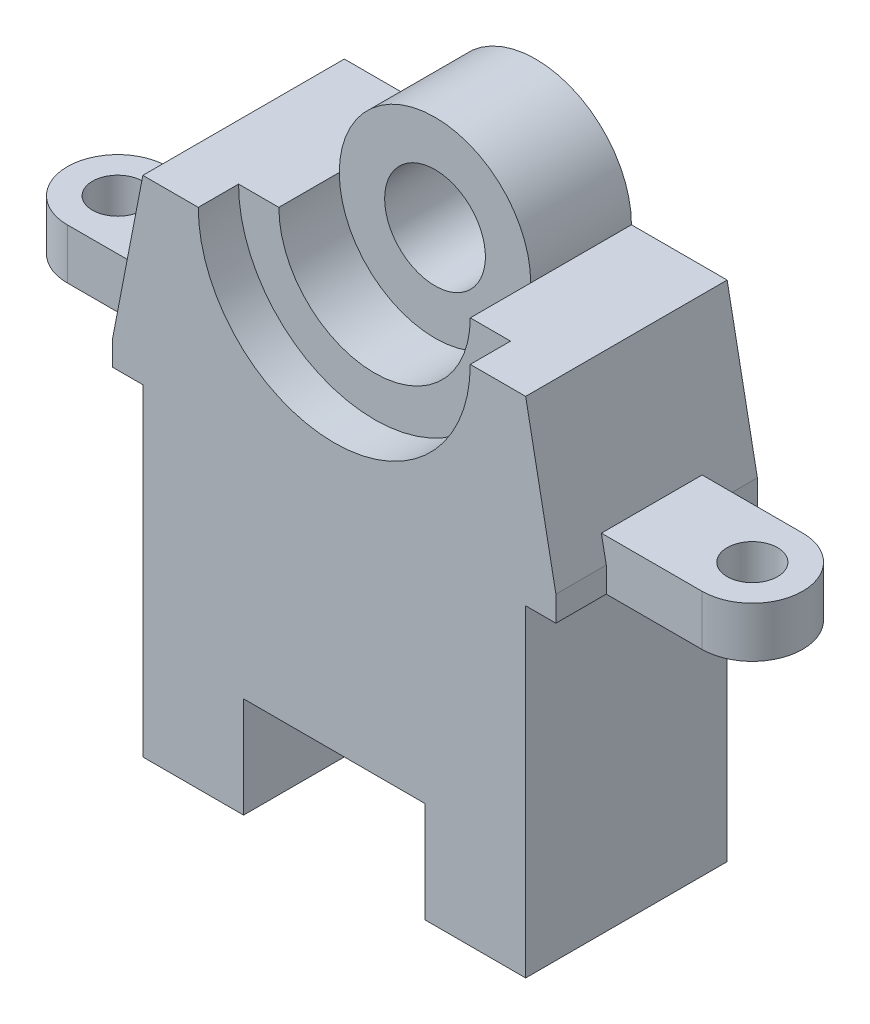
ISO-10303-21;
HEADER;
FILE_DESCRIPTION(('STEP AP214'),'2;1');
FILE_NAME('part.step','',(''),(''),'','','');
FILE_SCHEMA(('AUTOMOTIVE_DESIGN { 1 0 10303 214 1 1 1 1 }'));
ENDSEC;
DATA;
#1=APPLICATION_CONTEXT('core data for automotive mechanical design processes');
#2=APPLICATION_PROTOCOL_DEFINITION('international standard','automotive_design',2000,#1);
#3=PRODUCT_CONTEXT('',#1,'mechanical');
#4=PRODUCT('Part','Part','',(#3));
#5=PRODUCT_RELATED_PRODUCT_CATEGORY('part','',(#4));
#6=PRODUCT_DEFINITION_FORMATION('','',#4);
#7=PRODUCT_DEFINITION_CONTEXT('part definition',#1,'design');
#8=PRODUCT_DEFINITION('design','',#6,#7);
#9=PRODUCT_DEFINITION_SHAPE('','',#8);
#10=(LENGTH_UNIT() NAMED_UNIT(*) SI_UNIT(.MILLI.,.METRE.));
#11=(NAMED_UNIT(*) PLANE_ANGLE_UNIT() SI_UNIT($,.RADIAN.));
#12=(NAMED_UNIT(*) SI_UNIT($,.STERADIAN.) SOLID_ANGLE_UNIT());
#13=UNCERTAINTY_MEASURE_WITH_UNIT(LENGTH_MEASURE(1.E-05),#10,'distance_accuracy_value','');
#14=(GEOMETRIC_REPRESENTATION_CONTEXT(3) GLOBAL_UNCERTAINTY_ASSIGNED_CONTEXT((#13)) GLOBAL_UNIT_ASSIGNED_CONTEXT((#10,
#11,#12)) REPRESENTATION_CONTEXT('',''));
#15=CARTESIAN_POINT('',(0.,0.,0.));
#16=DIRECTION('',(0.,0.,1.));
#17=DIRECTION('',(1.,0.,0.));
#18=AXIS2_PLACEMENT_3D('',#15,#16,#17);
#19=CARTESIAN_POINT('',(82.,64.,40.));
#20=DIRECTION('',(-1.,0.,0.));
#21=DIRECTION('',(0.,-1.,0.));
#22=AXIS2_PLACEMENT_3D('',#19,#20,#21);
#23=PLANE('',#22);
#24=DIRECTION('',(0.,0.,-1.));
#25=VECTOR('',#24,1.);
#26=CARTESIAN_POINT('',(82.,64.,40.));
#27=LINE('',#26,#25);
#28=CARTESIAN_POINT('',(82.,64.,40.));
#29=VERTEX_POINT('',#28);
#30=CARTESIAN_POINT('',(82.,64.,30.));
#31=VERTEX_POINT('',#30);
#32=EDGE_CURVE('E495',#29,#31,#27,.T.);
#33=ORIENTED_EDGE('',*,*,#32,.T.);
#34=DIRECTION('',(0.,1.,0.));
#35=VECTOR('',#34,1.);
#36=CARTESIAN_POINT('',(82.,64.,30.));
#37=LINE('',#36,#35);
#38=CARTESIAN_POINT('',(82.,69.,30.));
#39=VERTEX_POINT('',#38);
#40=EDGE_CURVE('E272',#31,#39,#37,.T.);
#41=ORIENTED_EDGE('',*,*,#40,.T.);
#42=DIRECTION('',(0.,0.,-1.));
#43=VECTOR('',#42,1.);
#44=CARTESIAN_POINT('',(82.,69.,40.));
#45=LINE('',#44,#43);
#46=CARTESIAN_POINT('',(82.,69.,40.));
#47=VERTEX_POINT('',#46);
#48=EDGE_CURVE('E490',#47,#39,#45,.T.);
#49=ORIENTED_EDGE('',*,*,#48,.F.);
#50=DIRECTION('',(0.,1.,0.));
#51=VECTOR('',#50,1.);
#52=CARTESIAN_POINT('',(82.,64.,40.));
#53=LINE('',#52,#51);
#54=EDGE_CURVE('E400',#29,#47,#53,.T.);
#55=ORIENTED_EDGE('',*,*,#54,.F.);
#56=EDGE_LOOP('',(#33,#41,#49,#55));
#57=FACE_BOUND('',#56,.T.);
#58=ADVANCED_FACE('F39',(#57),#23,.F.);
#59=CARTESIAN_POINT('',(-6.,69.,40.));
#60=DIRECTION('',(1.,0.,0.));
#61=DIRECTION('',(0.,0.,-1.));
#62=AXIS2_PLACEMENT_3D('',#59,#60,#61);
#63=PLANE('',#62);
#64=DIRECTION('',(0.,0.,-1.));
#65=VECTOR('',#64,1.);
#66=CARTESIAN_POINT('',(-6.,69.,40.));
#67=LINE('',#66,#65);
#68=CARTESIAN_POINT('',(-6.,69.,40.));
#69=VERTEX_POINT('',#68);
#70=CARTESIAN_POINT('',(-6.,69.,30.));
#71=VERTEX_POINT('',#70);
#72=EDGE_CURVE('E477',#69,#71,#67,.T.);
#73=ORIENTED_EDGE('',*,*,#72,.T.);
#74=DIRECTION('',(0.,-1.,0.));
#75=VECTOR('',#74,1.);
#76=CARTESIAN_POINT('',(-6.,69.,30.));
#77=LINE('',#76,#75);
#78=CARTESIAN_POINT('',(-6.,64.,30.));
#79=VERTEX_POINT('',#78);
#80=EDGE_CURVE('E318',#71,#79,#77,.T.);
#81=ORIENTED_EDGE('',*,*,#80,.T.);
#82=DIRECTION('',(0.,0.,-1.));
#83=VECTOR('',#82,1.);
#84=CARTESIAN_POINT('',(-6.,64.,40.));
#85=LINE('',#84,#83);
#86=CARTESIAN_POINT('',(-6.,64.,40.));
#87=VERTEX_POINT('',#86);
#88=EDGE_CURVE('E472',#87,#79,#85,.T.);
#89=ORIENTED_EDGE('',*,*,#88,.F.);
#90=DIRECTION('',(0.,-1.,0.));
#91=VECTOR('',#90,1.);
#92=CARTESIAN_POINT('',(-6.,69.,40.));
#93=LINE('',#92,#91);
#94=EDGE_CURVE('E414',#69,#87,#93,.T.);
#95=ORIENTED_EDGE('',*,*,#94,.F.);
#96=EDGE_LOOP('',(#73,#81,#89,#95));
#97=FACE_BOUND('',#96,.T.);
#98=ADVANCED_FACE('F619',(#97),#63,.F.);
#99=CARTESIAN_POINT('',(38.,100.,0.));
#100=DIRECTION('',(0.,0.,1.));
#101=DIRECTION('',(1.,0.,0.));
#102=AXIS2_PLACEMENT_3D('',#99,#100,#101);
#103=CYLINDRICAL_SURFACE('',#102,19.);
#104=CARTESIAN_POINT('',(38.,100.,20.));
#105=DIRECTION('',(0.,0.,-1.));
#106=DIRECTION('',(-1.,0.,0.));
#107=AXIS2_PLACEMENT_3D('',#104,#105,#106);
#108=CIRCLE('',#107,19.);
#109=CARTESIAN_POINT('',(19.,100.,20.));
#110=VERTEX_POINT('',#109);
#111=CARTESIAN_POINT('',(57.,100.,20.));
#112=VERTEX_POINT('',#111);
#113=EDGE_CURVE('E527',#110,#112,#108,.F.);
#114=ORIENTED_EDGE('',*,*,#113,.F.);
#115=DIRECTION('',(0.,0.,1.));
#116=VECTOR('',#115,1.);
#117=CARTESIAN_POINT('',(19.,100.,0.));
#118=LINE('',#117,#116);
#119=CARTESIAN_POINT('',(19.,100.,32.));
#120=VERTEX_POINT('',#119);
#121=EDGE_CURVE('E350',#110,#120,#118,.T.);
#122=ORIENTED_EDGE('',*,*,#121,.T.);
#123=CARTESIAN_POINT('',(38.,100.,32.));
#124=DIRECTION('',(0.,0.,1.));
#125=DIRECTION('',(1.,0.,0.));
#126=AXIS2_PLACEMENT_3D('',#123,#124,#125);
#127=CIRCLE('',#126,19.);
#128=CARTESIAN_POINT('',(57.,100.,32.));
#129=VERTEX_POINT('',#128);
#130=EDGE_CURVE('E339',#120,#129,#127,.T.);
#131=ORIENTED_EDGE('',*,*,#130,.T.);
#132=DIRECTION('',(0.,0.,1.));
#133=VECTOR('',#132,1.);
#134=CARTESIAN_POINT('',(57.,100.,0.));
#135=LINE('',#134,#133);
#136=EDGE_CURVE('E345',#112,#129,#135,.T.);
#137=ORIENTED_EDGE('',*,*,#136,.F.);
#138=EDGE_LOOP('',(#114,#122,#131,#137));
#139=FACE_BOUND('',#138,.T.);
#140=ADVANCED_FACE('F561',(#139),#103,.F.);
#141=CARTESIAN_POINT('',(76.,100.,40.));
#142=DIRECTION('',(0.,-1.,0.));
#143=DIRECTION('',(1.,0.,0.));
#144=AXIS2_PLACEMENT_3D('',#141,#142,#143);
#145=PLANE('',#144);
#146=DIRECTION('',(-1.,0.,0.));
#147=VECTOR('',#146,1.);
#148=CARTESIAN_POINT('',(76.,100.,0.));
#149=LINE('',#148,#147);
#150=CARTESIAN_POINT('',(76.,100.,0.));
#151=VERTEX_POINT('',#150);
#152=CARTESIAN_POINT('',(57.,100.,0.));
#153=VERTEX_POINT('',#152);
#154=EDGE_CURVE('E454',#151,#153,#149,.T.);
#155=ORIENTED_EDGE('',*,*,#154,.T.);
#156=EDGE_CURVE('E351',#153,#112,#135,.T.);
#157=ORIENTED_EDGE('',*,*,#156,.T.);
#158=ORIENTED_EDGE('',*,*,#136,.T.);
#159=DIRECTION('',(-1.,0.,0.));
#160=VECTOR('',#159,1.);
#161=CARTESIAN_POINT('',(11.,100.,32.));
#162=LINE('',#161,#160);
#163=CARTESIAN_POINT('',(65.,100.,32.));
#164=VERTEX_POINT('',#163);
#165=EDGE_CURVE('E360',#164,#129,#162,.T.);
#166=ORIENTED_EDGE('',*,*,#165,.F.);
#167=DIRECTION('',(0.,0.,1.));
#168=VECTOR('',#167,1.);
#169=CARTESIAN_POINT('',(65.,100.,32.));
#170=LINE('',#169,#168);
#171=CARTESIAN_POINT('',(65.,100.,40.));
#172=VERTEX_POINT('',#171);
#173=EDGE_CURVE('E364',#164,#172,#170,.T.);
#174=ORIENTED_EDGE('',*,*,#173,.T.);
#175=DIRECTION('',(-1.,0.,0.));
#176=VECTOR('',#175,1.);
#177=CARTESIAN_POINT('',(76.,100.,40.));
#178=LINE('',#177,#176);
#179=CARTESIAN_POINT('',(76.,100.,40.));
#180=VERTEX_POINT('',#179);
#181=EDGE_CURVE('E407',#180,#172,#178,.T.);
#182=ORIENTED_EDGE('',*,*,#181,.F.);
#183=DIRECTION('',(0.,0.,-1.));
#184=VECTOR('',#183,1.);
#185=CARTESIAN_POINT('',(76.,100.,40.));
#186=LINE('',#185,#184);
#187=EDGE_CURVE('E485',#180,#151,#186,.T.);
#188=ORIENTED_EDGE('',*,*,#187,.T.);
#189=EDGE_LOOP('',(#155,#157,#158,#166,#174,#182,#188));
#190=FACE_BOUND('',#189,.T.);
#191=ADVANCED_FACE('F556',(#190),#145,.F.);
#192=CARTESIAN_POINT('',(0.,64.,40.));
#193=DIRECTION('',(1.,0.,0.));
#194=DIRECTION('',(0.,1.,0.));
#195=AXIS2_PLACEMENT_3D('',#192,#193,#194);
#196=PLANE('',#195);
#197=DIRECTION('',(0.,-1.,0.));
#198=VECTOR('',#197,1.);
#199=CARTESIAN_POINT('',(0.,64.,0.));
#200=LINE('',#199,#198);
#201=CARTESIAN_POINT('',(0.,64.,0.));
#202=VERTEX_POINT('',#201);
#203=CARTESIAN_POINT('',(0.,0.,0.));
#204=VERTEX_POINT('',#203);
#205=EDGE_CURVE('E370',#202,#204,#200,.T.);
#206=ORIENTED_EDGE('',*,*,#205,.T.);
#207=DIRECTION('',(0.,0.,-1.));
#208=VECTOR('',#207,1.);
#209=CARTESIAN_POINT('',(0.,0.,40.));
#210=LINE('',#209,#208);
#211=CARTESIAN_POINT('',(0.,0.,40.));
#212=VERTEX_POINT('',#211);
#213=EDGE_CURVE('E523',#212,#204,#210,.T.);
#214=ORIENTED_EDGE('',*,*,#213,.F.);
#215=DIRECTION('',(0.,-1.,0.));
#216=VECTOR('',#215,1.);
#217=CARTESIAN_POINT('',(0.,64.,40.));
#218=LINE('',#217,#216);
#219=CARTESIAN_POINT('',(0.,64.,40.));
#220=VERTEX_POINT('',#219);
#221=EDGE_CURVE('E374',#220,#212,#218,.T.);
#222=ORIENTED_EDGE('',*,*,#221,.F.);
#223=DIRECTION('',(0.,0.,-1.));
#224=VECTOR('',#223,1.);
#225=CARTESIAN_POINT('',(0.,64.,40.));
#226=LINE('',#225,#224);
#227=EDGE_CURVE('E420',#220,#202,#226,.T.);
#228=ORIENTED_EDGE('',*,*,#227,.T.);
#229=EDGE_LOOP('',(#206,#214,#222,#228));
#230=FACE_BOUND('',#229,.T.);
#231=ADVANCED_FACE('F41',(#230),#196,.F.);
#232=CARTESIAN_POINT('',(0.,0.,40.));
#233=DIRECTION('',(0.,1.,0.));
#234=DIRECTION('',(0.,0.,1.));
#235=AXIS2_PLACEMENT_3D('',#232,#233,#234);
#236=PLANE('',#235);
#237=DIRECTION('',(1.,0.,0.));
#238=VECTOR('',#237,1.);
#239=CARTESIAN_POINT('',(0.,0.,0.));
#240=LINE('',#239,#238);
#241=CARTESIAN_POINT('',(20.,0.,0.));
#242=VERTEX_POINT('',#241);
#243=EDGE_CURVE('E424',#204,#242,#240,.T.);
#244=ORIENTED_EDGE('',*,*,#243,.T.);
#245=DIRECTION('',(0.,0.,-1.));
#246=VECTOR('',#245,1.);
#247=CARTESIAN_POINT('',(20.,0.,40.));
#248=LINE('',#247,#246);
#249=CARTESIAN_POINT('',(20.,0.,40.));
#250=VERTEX_POINT('',#249);
#251=EDGE_CURVE('E519',#250,#242,#248,.T.);
#252=ORIENTED_EDGE('',*,*,#251,.F.);
#253=DIRECTION('',(1.,0.,0.));
#254=VECTOR('',#253,1.);
#255=CARTESIAN_POINT('',(0.,0.,40.));
#256=LINE('',#255,#254);
#257=EDGE_CURVE('E378',#212,#250,#256,.T.);
#258=ORIENTED_EDGE('',*,*,#257,.F.);
#259=ORIENTED_EDGE('',*,*,#213,.T.);
#260=EDGE_LOOP('',(#244,#252,#258,#259));
#261=FACE_BOUND('',#260,.T.);
#262=ADVANCED_FACE('F629',(#261),#236,.F.);
#263=CARTESIAN_POINT('',(20.,0.,40.));
#264=DIRECTION('',(-1.,0.,0.));
#265=DIRECTION('',(0.,-1.,0.));
#266=AXIS2_PLACEMENT_3D('',#263,#264,#265);
#267=PLANE('',#266);
#268=DIRECTION('',(0.,1.,0.));
#269=VECTOR('',#268,1.);
#270=CARTESIAN_POINT('',(20.,0.,0.));
#271=LINE('',#270,#269);
#272=CARTESIAN_POINT('',(20.,20.,0.));
#273=VERTEX_POINT('',#272);
#274=EDGE_CURVE('E427',#242,#273,#271,.T.);
#275=ORIENTED_EDGE('',*,*,#274,.T.);
#276=DIRECTION('',(0.,0.,-1.));
#277=VECTOR('',#276,1.);
#278=CARTESIAN_POINT('',(20.,20.,40.));
#279=LINE('',#278,#277);
#280=CARTESIAN_POINT('',(20.,20.,40.));
#281=VERTEX_POINT('',#280);
#282=EDGE_CURVE('E515',#281,#273,#279,.T.);
#283=ORIENTED_EDGE('',*,*,#282,.F.);
#284=DIRECTION('',(0.,1.,0.));
#285=VECTOR('',#284,1.);
#286=CARTESIAN_POINT('',(20.,0.,40.));
#287=LINE('',#286,#285);
#288=EDGE_CURVE('E382',#250,#281,#287,.T.);
#289=ORIENTED_EDGE('',*,*,#288,.F.);
#290=ORIENTED_EDGE('',*,*,#251,.T.);
#291=EDGE_LOOP('',(#275,#283,#289,#290));
#292=FACE_BOUND('',#291,.T.);
#293=ADVANCED_FACE('F636',(#292),#267,.F.);
#294=CARTESIAN_POINT('',(20.,20.,40.));
#295=DIRECTION('',(0.,1.,0.));
#296=DIRECTION('',(0.,0.,1.));
#297=AXIS2_PLACEMENT_3D('',#294,#295,#296);
#298=PLANE('',#297);
#299=DIRECTION('',(1.,0.,0.));
#300=VECTOR('',#299,1.);
#301=CARTESIAN_POINT('',(20.,20.,0.));
#302=LINE('',#301,#300);
#303=CARTESIAN_POINT('',(56.,20.,0.));
#304=VERTEX_POINT('',#303);
#305=EDGE_CURVE('E430',#273,#304,#302,.T.);
#306=ORIENTED_EDGE('',*,*,#305,.T.);
#307=DIRECTION('',(0.,0.,-1.));
#308=VECTOR('',#307,1.);
#309=CARTESIAN_POINT('',(56.,20.,40.));
#310=LINE('',#309,#308);
#311=CARTESIAN_POINT('',(56.,20.,40.));
#312=VERTEX_POINT('',#311);
#313=EDGE_CURVE('E511',#312,#304,#310,.T.);
#314=ORIENTED_EDGE('',*,*,#313,.F.);
#315=DIRECTION('',(1.,0.,0.));
#316=VECTOR('',#315,1.);
#317=CARTESIAN_POINT('',(20.,20.,40.));
#318=LINE('',#317,#316);
#319=EDGE_CURVE('E385',#281,#312,#318,.T.);
#320=ORIENTED_EDGE('',*,*,#319,.F.);
#321=ORIENTED_EDGE('',*,*,#282,.T.);
#322=EDGE_LOOP('',(#306,#314,#320,#321));
#323=FACE_BOUND('',#322,.T.);
#324=ADVANCED_FACE('F640',(#323),#298,.F.);
#325=CARTESIAN_POINT('',(56.,20.,40.));
#326=DIRECTION('',(1.,0.,0.));
#327=DIRECTION('',(0.,1.,0.));
#328=AXIS2_PLACEMENT_3D('',#325,#326,#327);
#329=PLANE('',#328);
#330=DIRECTION('',(0.,-1.,0.));
#331=VECTOR('',#330,1.);
#332=CARTESIAN_POINT('',(56.,20.,0.));
#333=LINE('',#332,#331);
#334=CARTESIAN_POINT('',(56.,0.,0.));
#335=VERTEX_POINT('',#334);
#336=EDGE_CURVE('E433',#304,#335,#333,.T.);
#337=ORIENTED_EDGE('',*,*,#336,.T.);
#338=DIRECTION('',(0.,0.,-1.));
#339=VECTOR('',#338,1.);
#340=CARTESIAN_POINT('',(56.,0.,40.));
#341=LINE('',#340,#339);
#342=CARTESIAN_POINT('',(56.,0.,40.));
#343=VERTEX_POINT('',#342);
#344=EDGE_CURVE('E507',#343,#335,#341,.T.);
#345=ORIENTED_EDGE('',*,*,#344,.F.);
#346=DIRECTION('',(0.,-1.,0.));
#347=VECTOR('',#346,1.);
#348=CARTESIAN_POINT('',(56.,20.,40.));
#349=LINE('',#348,#347);
#350=EDGE_CURVE('E388',#312,#343,#349,.T.);
#351=ORIENTED_EDGE('',*,*,#350,.F.);
#352=ORIENTED_EDGE('',*,*,#313,.T.);
#353=EDGE_LOOP('',(#337,#345,#351,#352));
#354=FACE_BOUND('',#353,.T.);
#355=ADVANCED_FACE('F645',(#354),#329,.F.);
#356=CARTESIAN_POINT('',(56.,0.,40.));
#357=DIRECTION('',(0.,1.,0.));
#358=DIRECTION('',(0.,0.,1.));
#359=AXIS2_PLACEMENT_3D('',#356,#357,#358);
#360=PLANE('',#359);
#361=DIRECTION('',(1.,0.,0.));
#362=VECTOR('',#361,1.);
#363=CARTESIAN_POINT('',(56.,0.,0.));
#364=LINE('',#363,#362);
#365=CARTESIAN_POINT('',(76.,0.,0.));
#366=VERTEX_POINT('',#365);
#367=EDGE_CURVE('E436',#335,#366,#364,.T.);
#368=ORIENTED_EDGE('',*,*,#367,.T.);
#369=DIRECTION('',(0.,0.,-1.));
#370=VECTOR('',#369,1.);
#371=CARTESIAN_POINT('',(76.,0.,40.));
#372=LINE('',#371,#370);
#373=CARTESIAN_POINT('',(76.,0.,40.));
#374=VERTEX_POINT('',#373);
#375=EDGE_CURVE('E503',#374,#366,#372,.T.);
#376=ORIENTED_EDGE('',*,*,#375,.F.);
#377=DIRECTION('',(1.,0.,0.));
#378=VECTOR('',#377,1.);
#379=CARTESIAN_POINT('',(56.,0.,40.));
#380=LINE('',#379,#378);
#381=EDGE_CURVE('E391',#343,#374,#380,.T.);
#382=ORIENTED_EDGE('',*,*,#381,.F.);
#383=ORIENTED_EDGE('',*,*,#344,.T.);
#384=EDGE_LOOP('',(#368,#376,#382,#383));
#385=FACE_BOUND('',#384,.T.);
#386=ADVANCED_FACE('F651',(#385),#360,.F.);
#387=CARTESIAN_POINT('',(76.,0.,40.));
#388=DIRECTION('',(-1.,0.,0.));
#389=DIRECTION('',(0.,0.,1.));
#390=AXIS2_PLACEMENT_3D('',#387,#388,#389);
#391=PLANE('',#390);
#392=DIRECTION('',(0.,1.,0.));
#393=VECTOR('',#392,1.);
#394=CARTESIAN_POINT('',(76.,0.,0.));
#395=LINE('',#394,#393);
#396=CARTESIAN_POINT('',(76.,64.,0.));
#397=VERTEX_POINT('',#396);
#398=EDGE_CURVE('E439',#366,#397,#395,.T.);
#399=ORIENTED_EDGE('',*,*,#398,.T.);
#400=DIRECTION('',(0.,0.,-1.));
#401=VECTOR('',#400,1.);
#402=CARTESIAN_POINT('',(76.,64.,40.));
#403=LINE('',#402,#401);
#404=CARTESIAN_POINT('',(76.,64.,40.));
#405=VERTEX_POINT('',#404);
#406=EDGE_CURVE('E499',#405,#397,#403,.T.);
#407=ORIENTED_EDGE('',*,*,#406,.F.);
#408=DIRECTION('',(0.,1.,0.));
#409=VECTOR('',#408,1.);
#410=CARTESIAN_POINT('',(76.,0.,40.));
#411=LINE('',#410,#409);
#412=EDGE_CURVE('E394',#374,#405,#411,.T.);
#413=ORIENTED_EDGE('',*,*,#412,.F.);
#414=ORIENTED_EDGE('',*,*,#375,.T.);
#415=EDGE_LOOP('',(#399,#407,#413,#414));
#416=FACE_BOUND('',#415,.T.);
#417=ADVANCED_FACE('F655',(#416),#391,.F.);
#418=CARTESIAN_POINT('',(76.,64.,40.));
#419=DIRECTION('',(0.,1.,0.));
#420=DIRECTION('',(0.,0.,1.));
#421=AXIS2_PLACEMENT_3D('',#418,#419,#420);
#422=PLANE('',#421);
#423=DIRECTION('',(-1.,0.,0.));
#424=VECTOR('',#423,1.);
#425=CARTESIAN_POINT('',(78.9534647464851,64.,30.));
#426=LINE('',#425,#424);
#427=CARTESIAN_POINT('',(101.,64.,30.));
#428=VERTEX_POINT('',#427);
#429=EDGE_CURVE('E256',#428,#31,#426,.T.);
#430=ORIENTED_EDGE('',*,*,#429,.T.);
#431=ORIENTED_EDGE('',*,*,#32,.F.);
#432=DIRECTION('',(1.,0.,0.));
#433=VECTOR('',#432,1.);
#434=CARTESIAN_POINT('',(76.,64.,40.));
#435=LINE('',#434,#433);
#436=EDGE_CURVE('E397',#405,#29,#435,.T.);
#437=ORIENTED_EDGE('',*,*,#436,.F.);
#438=ORIENTED_EDGE('',*,*,#406,.T.);
#439=DIRECTION('',(1.,0.,0.));
#440=VECTOR('',#439,1.);
#441=CARTESIAN_POINT('',(76.,64.,0.));
#442=LINE('',#441,#440);
#443=CARTESIAN_POINT('',(82.,64.,0.));
#444=VERTEX_POINT('',#443);
#445=EDGE_CURVE('E442',#397,#444,#442,.T.);
#446=ORIENTED_EDGE('',*,*,#445,.T.);
#447=CARTESIAN_POINT('',(82.,64.,10.));
#448=VERTEX_POINT('',#447);
#449=EDGE_CURVE('E494',#448,#444,#27,.T.);
#450=ORIENTED_EDGE('',*,*,#449,.F.);
#451=DIRECTION('',(1.,0.,0.));
#452=VECTOR('',#451,1.);
#453=CARTESIAN_POINT('',(78.9534647464851,64.,10.));
#454=LINE('',#453,#452);
#455=CARTESIAN_POINT('',(101.,64.,10.));
#456=VERTEX_POINT('',#455);
#457=EDGE_CURVE('E260',#448,#456,#454,.T.);
#458=ORIENTED_EDGE('',*,*,#457,.T.);
#459=CARTESIAN_POINT('',(101.,64.,20.));
#460=DIRECTION('',(0.,-1.,0.));
#461=DIRECTION('',(0.,0.,1.));
#462=AXIS2_PLACEMENT_3D('',#459,#460,#461);
#463=CIRCLE('',#462,10.);
#464=EDGE_CURVE('E245',#456,#428,#463,.T.);
#465=ORIENTED_EDGE('',*,*,#464,.T.);
#466=EDGE_LOOP('',(#430,#431,#437,#438,#446,#450,#458,#465));
#467=FACE_BOUND('',#466,.T.);
#468=CARTESIAN_POINT('',(101.,64.,20.));
#469=DIRECTION('',(0.,-1.,0.));
#470=DIRECTION('',(0.,0.,-1.));
#471=AXIS2_PLACEMENT_3D('',#468,#469,#470);
#472=CIRCLE('',#471,5.);
#473=CARTESIAN_POINT('',(101.,64.,15.));
#474=VERTEX_POINT('',#473);
#475=EDGE_CURVE('E670',#474,#474,#472,.T.);
#476=ORIENTED_EDGE('',*,*,#475,.F.);
#477=EDGE_LOOP('',(#476));
#478=FACE_BOUND('',#477,.T.);
#479=ADVANCED_FACE('F660',(#467,#478),#422,.F.);
#480=CARTESIAN_POINT('',(82.,69.,10.));
#481=VERTEX_POINT('',#480);
#482=CARTESIAN_POINT('',(82.,69.,0.));
#483=VERTEX_POINT('',#482);
#484=EDGE_CURVE('E489',#481,#483,#45,.T.);
#485=ORIENTED_EDGE('',*,*,#484,.F.);
#486=DIRECTION('',(0.,-1.,0.));
#487=VECTOR('',#486,1.);
#488=CARTESIAN_POINT('',(82.,64.,10.));
#489=LINE('',#488,#487);
#490=EDGE_CURVE('E267',#481,#448,#489,.T.);
#491=ORIENTED_EDGE('',*,*,#490,.T.);
#492=ORIENTED_EDGE('',*,*,#449,.T.);
#493=DIRECTION('',(0.,1.,0.));
#494=VECTOR('',#493,1.);
#495=CARTESIAN_POINT('',(82.,64.,0.));
#496=LINE('',#495,#494);
#497=EDGE_CURVE('E446',#444,#483,#496,.T.);
#498=ORIENTED_EDGE('',*,*,#497,.T.);
#499=EDGE_LOOP('',(#485,#491,#492,#498));
#500=FACE_BOUND('',#499,.T.);
#501=ADVANCED_FACE('F540',(#500),#23,.F.);
#502=CARTESIAN_POINT('',(82.,69.,40.));
#503=DIRECTION('',(-0.981779850590281,-0.190021906565861,0.));
#504=DIRECTION('',(0.190021906565861,-0.981779850590281,0.));
#505=AXIS2_PLACEMENT_3D('',#502,#503,#504);
#506=PLANE('',#505);
#507=ORIENTED_EDGE('',*,*,#48,.T.);
#508=DIRECTION('',(-0.190021906565861,0.981779850590281,0.));
#509=VECTOR('',#508,1.);
#510=CARTESIAN_POINT('',(82.,69.,30.));
#511=LINE('',#510,#509);
#512=CARTESIAN_POINT('',(81.0322580645161,74.,30.));
#513=VERTEX_POINT('',#512);
#514=EDGE_CURVE('E11',#39,#513,#511,.T.);
#515=ORIENTED_EDGE('',*,*,#514,.T.);
#516=DIRECTION('',(0.,0.,-1.));
#517=VECTOR('',#516,1.);
#518=CARTESIAN_POINT('',(81.0322580645161,74.,40.));
#519=LINE('',#518,#517);
#520=CARTESIAN_POINT('',(81.0322580645161,74.,10.));
#521=VERTEX_POINT('',#520);
#522=EDGE_CURVE('E533',#513,#521,#519,.T.);
#523=ORIENTED_EDGE('',*,*,#522,.T.);
#524=DIRECTION('',(0.190021906565861,-0.981779850590281,0.));
#525=VECTOR('',#524,1.);
#526=CARTESIAN_POINT('',(82.,69.,10.));
#527=LINE('',#526,#525);
#528=EDGE_CURVE('E48',#521,#481,#527,.T.);
#529=ORIENTED_EDGE('',*,*,#528,.T.);
#530=ORIENTED_EDGE('',*,*,#484,.T.);
#531=DIRECTION('',(-0.190021906565861,0.981779850590281,0.));
#532=VECTOR('',#531,1.);
#533=CARTESIAN_POINT('',(82.,69.,0.));
#534=LINE('',#533,#532);
#535=EDGE_CURVE('E450',#483,#151,#534,.T.);
#536=ORIENTED_EDGE('',*,*,#535,.T.);
#537=ORIENTED_EDGE('',*,*,#187,.F.);
#538=DIRECTION('',(-0.190021906565861,0.981779850590281,0.));
#539=VECTOR('',#538,1.);
#540=CARTESIAN_POINT('',(82.,69.,40.));
#541=LINE('',#540,#539);
#542=EDGE_CURVE('E403',#47,#180,#541,.T.);
#543=ORIENTED_EDGE('',*,*,#542,.F.);
#544=EDGE_LOOP('',(#507,#515,#523,#529,#530,#536,#537,#543));
#545=FACE_BOUND('',#544,.T.);
#546=ADVANCED_FACE('F538',(#545),#506,.F.);
#547=CARTESIAN_POINT('',(11.,100.,32.));
#548=VERTEX_POINT('',#547);
#549=EDGE_CURVE('E359',#120,#548,#162,.T.);
#550=ORIENTED_EDGE('',*,*,#549,.F.);
#551=ORIENTED_EDGE('',*,*,#121,.F.);
#552=CARTESIAN_POINT('',(19.,100.,0.));
#553=VERTEX_POINT('',#552);
#554=EDGE_CURVE('E346',#553,#110,#118,.T.);
#555=ORIENTED_EDGE('',*,*,#554,.F.);
#556=CARTESIAN_POINT('',(0.,100.,0.));
#557=VERTEX_POINT('',#556);
#558=EDGE_CURVE('E453',#553,#557,#149,.T.);
#559=ORIENTED_EDGE('',*,*,#558,.T.);
#560=DIRECTION('',(0.,0.,-1.));
#561=VECTOR('',#560,1.);
#562=CARTESIAN_POINT('',(0.,100.,40.));
#563=LINE('',#562,#561);
#564=CARTESIAN_POINT('',(0.,100.,40.));
#565=VERTEX_POINT('',#564);
#566=EDGE_CURVE('E481',#565,#557,#563,.T.);
#567=ORIENTED_EDGE('',*,*,#566,.F.);
#568=CARTESIAN_POINT('',(11.,100.,40.));
#569=VERTEX_POINT('',#568);
#570=EDGE_CURVE('E406',#569,#565,#178,.T.);
#571=ORIENTED_EDGE('',*,*,#570,.F.);
#572=DIRECTION('',(0.,0.,1.));
#573=VECTOR('',#572,1.);
#574=CARTESIAN_POINT('',(11.,100.,32.));
#575=LINE('',#574,#573);
#576=EDGE_CURVE('E367',#548,#569,#575,.T.);
#577=ORIENTED_EDGE('',*,*,#576,.F.);
#578=EDGE_LOOP('',(#550,#551,#555,#559,#567,#571,#577));
#579=FACE_BOUND('',#578,.T.);
#580=ADVANCED_FACE('F573',(#579),#145,.F.);
#581=CARTESIAN_POINT('',(0.,100.,40.));
#582=DIRECTION('',(0.981779850590281,-0.190021906565861,0.));
#583=DIRECTION('',(0.190021906565861,0.981779850590281,0.));
#584=AXIS2_PLACEMENT_3D('',#581,#582,#583);
#585=PLANE('',#584);
#586=DIRECTION('',(0.,0.,-1.));
#587=VECTOR('',#586,1.);
#588=CARTESIAN_POINT('',(-5.03225806451613,74.,40.));
#589=LINE('',#588,#587);
#590=CARTESIAN_POINT('',(-5.03225806451613,74.,30.));
#591=VERTEX_POINT('',#590);
#592=CARTESIAN_POINT('',(-5.03225806451613,74.,10.));
#593=VERTEX_POINT('',#592);
#594=EDGE_CURVE('E530',#591,#593,#589,.T.);
#595=ORIENTED_EDGE('',*,*,#594,.F.);
#596=DIRECTION('',(-0.190021906565861,-0.981779850590281,0.));
#597=VECTOR('',#596,1.);
#598=CARTESIAN_POINT('',(0.,100.,30.));
#599=LINE('',#598,#597);
#600=EDGE_CURVE('E322',#591,#71,#599,.T.);
#601=ORIENTED_EDGE('',*,*,#600,.T.);
#602=ORIENTED_EDGE('',*,*,#72,.F.);
#603=DIRECTION('',(-0.190021906565861,-0.981779850590281,0.));
#604=VECTOR('',#603,1.);
#605=CARTESIAN_POINT('',(0.,100.,40.));
#606=LINE('',#605,#604);
#607=EDGE_CURVE('E411',#565,#69,#606,.T.);
#608=ORIENTED_EDGE('',*,*,#607,.F.);
#609=ORIENTED_EDGE('',*,*,#566,.T.);
#610=DIRECTION('',(-0.190021906565861,-0.981779850590281,0.));
#611=VECTOR('',#610,1.);
#612=CARTESIAN_POINT('',(0.,100.,0.));
#613=LINE('',#612,#611);
#614=CARTESIAN_POINT('',(-6.,69.,0.));
#615=VERTEX_POINT('',#614);
#616=EDGE_CURVE('E458',#557,#615,#613,.T.);
#617=ORIENTED_EDGE('',*,*,#616,.T.);
#618=CARTESIAN_POINT('',(-6.,69.,10.));
#619=VERTEX_POINT('',#618);
#620=EDGE_CURVE('E476',#619,#615,#67,.T.);
#621=ORIENTED_EDGE('',*,*,#620,.F.);
#622=DIRECTION('',(0.190021906565861,0.981779850590281,0.));
#623=VECTOR('',#622,1.);
#624=CARTESIAN_POINT('',(0.,100.,10.));
#625=LINE('',#624,#623);
#626=EDGE_CURVE('E314',#619,#593,#625,.T.);
#627=ORIENTED_EDGE('',*,*,#626,.T.);
#628=EDGE_LOOP('',(#595,#601,#602,#608,#609,#617,#621,#627));
#629=FACE_BOUND('',#628,.T.);
#630=ADVANCED_FACE('F596',(#629),#585,.F.);
#631=CARTESIAN_POINT('',(-6.,64.,10.));
#632=VERTEX_POINT('',#631);
#633=CARTESIAN_POINT('',(-6.,64.,0.));
#634=VERTEX_POINT('',#633);
#635=EDGE_CURVE('E471',#632,#634,#85,.T.);
#636=ORIENTED_EDGE('',*,*,#635,.F.);
#637=DIRECTION('',(0.,1.,0.));
#638=VECTOR('',#637,1.);
#639=CARTESIAN_POINT('',(-6.,69.,10.));
#640=LINE('',#639,#638);
#641=EDGE_CURVE('E307',#632,#619,#640,.T.);
#642=ORIENTED_EDGE('',*,*,#641,.T.);
#643=ORIENTED_EDGE('',*,*,#620,.T.);
#644=DIRECTION('',(0.,-1.,0.));
#645=VECTOR('',#644,1.);
#646=CARTESIAN_POINT('',(-6.,69.,0.));
#647=LINE('',#646,#645);
#648=EDGE_CURVE('E462',#615,#634,#647,.T.);
#649=ORIENTED_EDGE('',*,*,#648,.T.);
#650=EDGE_LOOP('',(#636,#642,#643,#649));
#651=FACE_BOUND('',#650,.T.);
#652=ADVANCED_FACE('F603',(#651),#63,.F.);
#653=CARTESIAN_POINT('',(-6.,64.,40.));
#654=DIRECTION('',(0.,1.,0.));
#655=DIRECTION('',(0.,0.,1.));
#656=AXIS2_PLACEMENT_3D('',#653,#654,#655);
#657=PLANE('',#656);
#658=ORIENTED_EDGE('',*,*,#88,.T.);
#659=DIRECTION('',(-1.,0.,0.));
#660=VECTOR('',#659,1.);
#661=CARTESIAN_POINT('',(-3.17104739971554,64.,30.));
#662=LINE('',#661,#660);
#663=CARTESIAN_POINT('',(-25.,64.,30.));
#664=VERTEX_POINT('',#663);
#665=EDGE_CURVE('E281',#79,#664,#662,.T.);
#666=ORIENTED_EDGE('',*,*,#665,.T.);
#667=CARTESIAN_POINT('',(-25.,64.,20.));
#668=DIRECTION('',(0.,-1.,0.));
#669=DIRECTION('',(0.,0.,-1.));
#670=AXIS2_PLACEMENT_3D('',#667,#668,#669);
#671=CIRCLE('',#670,10.);
#672=CARTESIAN_POINT('',(-25.,64.,10.));
#673=VERTEX_POINT('',#672);
#674=EDGE_CURVE('E299',#664,#673,#671,.T.);
#675=ORIENTED_EDGE('',*,*,#674,.T.);
#676=DIRECTION('',(1.,0.,0.));
#677=VECTOR('',#676,1.);
#678=CARTESIAN_POINT('',(-3.17104739971554,64.,10.));
#679=LINE('',#678,#677);
#680=EDGE_CURVE('E63',#673,#632,#679,.T.);
#681=ORIENTED_EDGE('',*,*,#680,.T.);
#682=ORIENTED_EDGE('',*,*,#635,.T.);
#683=DIRECTION('',(1.,0.,0.));
#684=VECTOR('',#683,1.);
#685=CARTESIAN_POINT('',(-6.,64.,0.));
#686=LINE('',#685,#684);
#687=EDGE_CURVE('E379',#634,#202,#686,.T.);
#688=ORIENTED_EDGE('',*,*,#687,.T.);
#689=ORIENTED_EDGE('',*,*,#227,.F.);
#690=DIRECTION('',(1.,0.,0.));
#691=VECTOR('',#690,1.);
#692=CARTESIAN_POINT('',(-6.,64.,40.));
#693=LINE('',#692,#691);
#694=EDGE_CURVE('E417',#87,#220,#693,.T.);
#695=ORIENTED_EDGE('',*,*,#694,.F.);
#696=EDGE_LOOP('',(#658,#666,#675,#681,#682,#688,#689,#695));
#697=FACE_BOUND('',#696,.T.);
#698=CARTESIAN_POINT('',(-25.,64.,20.));
#699=DIRECTION('',(0.,-1.,0.));
#700=DIRECTION('',(0.,0.,-1.));
#701=AXIS2_PLACEMENT_3D('',#698,#699,#700);
#702=CIRCLE('',#701,5.);
#703=CARTESIAN_POINT('',(-25.,64.,15.));
#704=VERTEX_POINT('',#703);
#705=EDGE_CURVE('E276',#704,#704,#702,.T.);
#706=ORIENTED_EDGE('',*,*,#705,.F.);
#707=EDGE_LOOP('',(#706));
#708=FACE_BOUND('',#707,.T.);
#709=ADVANCED_FACE('F625',(#697,#708),#657,.F.);
#710=CARTESIAN_POINT('',(0.,0.,40.));
#711=DIRECTION('',(0.,0.,1.));
#712=DIRECTION('',(1.,0.,0.));
#713=AXIS2_PLACEMENT_3D('',#710,#711,#712);
#714=PLANE('',#713);
#715=CARTESIAN_POINT('',(38.,100.,40.));
#716=DIRECTION('',(0.,0.,1.));
#717=DIRECTION('',(1.,0.,0.));
#718=AXIS2_PLACEMENT_3D('',#715,#716,#717);
#719=CIRCLE('',#718,27.);
#720=EDGE_CURVE('E349',#569,#172,#719,.T.);
#721=ORIENTED_EDGE('',*,*,#720,.F.);
#722=ORIENTED_EDGE('',*,*,#570,.T.);
#723=ORIENTED_EDGE('',*,*,#607,.T.);
#724=ORIENTED_EDGE('',*,*,#94,.T.);
#725=ORIENTED_EDGE('',*,*,#694,.T.);
#726=ORIENTED_EDGE('',*,*,#221,.T.);
#727=ORIENTED_EDGE('',*,*,#257,.T.);
#728=ORIENTED_EDGE('',*,*,#288,.T.);
#729=ORIENTED_EDGE('',*,*,#319,.T.);
#730=ORIENTED_EDGE('',*,*,#350,.T.);
#731=ORIENTED_EDGE('',*,*,#381,.T.);
#732=ORIENTED_EDGE('',*,*,#412,.T.);
#733=ORIENTED_EDGE('',*,*,#436,.T.);
#734=ORIENTED_EDGE('',*,*,#54,.T.);
#735=ORIENTED_EDGE('',*,*,#542,.T.);
#736=ORIENTED_EDGE('',*,*,#181,.T.);
#737=EDGE_LOOP('',(#721,#722,#723,#724,#725,#726,#727,#728,#729,#730,#731,#732,#733,#734,#735,#736));
#738=FACE_BOUND('',#737,.T.);
#739=ADVANCED_FACE('F577',(#738),#714,.T.);
#740=CARTESIAN_POINT('',(0.,0.,0.));
#741=DIRECTION('',(0.,0.,1.));
#742=DIRECTION('',(1.,0.,0.));
#743=AXIS2_PLACEMENT_3D('',#740,#741,#742);
#744=PLANE('',#743);
#745=ORIENTED_EDGE('',*,*,#558,.F.);
#746=CARTESIAN_POINT('',(38.,100.,0.));
#747=DIRECTION('',(0.,0.,-1.));
#748=DIRECTION('',(-1.,0.,0.));
#749=AXIS2_PLACEMENT_3D('',#746,#747,#748);
#750=CIRCLE('',#749,19.);
#751=EDGE_CURVE('E331',#553,#153,#750,.T.);
#752=ORIENTED_EDGE('',*,*,#751,.T.);
#753=ORIENTED_EDGE('',*,*,#154,.F.);
#754=ORIENTED_EDGE('',*,*,#535,.F.);
#755=ORIENTED_EDGE('',*,*,#497,.F.);
#756=ORIENTED_EDGE('',*,*,#445,.F.);
#757=ORIENTED_EDGE('',*,*,#398,.F.);
#758=ORIENTED_EDGE('',*,*,#367,.F.);
#759=ORIENTED_EDGE('',*,*,#336,.F.);
#760=ORIENTED_EDGE('',*,*,#305,.F.);
#761=ORIENTED_EDGE('',*,*,#274,.F.);
#762=ORIENTED_EDGE('',*,*,#243,.F.);
#763=ORIENTED_EDGE('',*,*,#205,.F.);
#764=ORIENTED_EDGE('',*,*,#687,.F.);
#765=ORIENTED_EDGE('',*,*,#648,.F.);
#766=ORIENTED_EDGE('',*,*,#616,.F.);
#767=EDGE_LOOP('',(#745,#752,#753,#754,#755,#756,#757,#758,#759,#760,#761,#762,#763,#764,#765,#766));
#768=FACE_BOUND('',#767,.T.);
#769=CARTESIAN_POINT('',(38.,100.,0.));
#770=DIRECTION('',(0.,0.,-1.));
#771=DIRECTION('',(-1.,0.,0.));
#772=AXIS2_PLACEMENT_3D('',#769,#770,#771);
#773=CIRCLE('',#772,10.);
#774=CARTESIAN_POINT('',(28.,100.,0.));
#775=VERTEX_POINT('',#774);
#776=EDGE_CURVE('E326',#775,#775,#773,.T.);
#777=ORIENTED_EDGE('',*,*,#776,.F.);
#778=EDGE_LOOP('',(#777));
#779=FACE_BOUND('',#778,.T.);
#780=ADVANCED_FACE('F585',(#768,#779),#744,.F.);
#781=CARTESIAN_POINT('',(38.,100.,32.));
#782=DIRECTION('',(0.,0.,1.));
#783=DIRECTION('',(1.,0.,0.));
#784=AXIS2_PLACEMENT_3D('',#781,#782,#783);
#785=CYLINDRICAL_SURFACE('',#784,27.);
#786=ORIENTED_EDGE('',*,*,#720,.T.);
#787=ORIENTED_EDGE('',*,*,#173,.F.);
#788=CARTESIAN_POINT('',(38.,100.,32.));
#789=DIRECTION('',(0.,0.,1.));
#790=DIRECTION('',(1.,0.,0.));
#791=AXIS2_PLACEMENT_3D('',#788,#789,#790);
#792=CIRCLE('',#791,27.);
#793=EDGE_CURVE('E355',#548,#164,#792,.T.);
#794=ORIENTED_EDGE('',*,*,#793,.F.);
#795=ORIENTED_EDGE('',*,*,#576,.T.);
#796=EDGE_LOOP('',(#786,#787,#794,#795));
#797=FACE_BOUND('',#796,.T.);
#798=ADVANCED_FACE('F569',(#797),#785,.F.);
#799=CARTESIAN_POINT('',(38.,100.,32.));
#800=DIRECTION('',(0.,0.,1.));
#801=DIRECTION('',(1.,0.,0.));
#802=AXIS2_PLACEMENT_3D('',#799,#800,#801);
#803=PLANE('',#802);
#804=ORIENTED_EDGE('',*,*,#130,.F.);
#805=ORIENTED_EDGE('',*,*,#549,.T.);
#806=ORIENTED_EDGE('',*,*,#793,.T.);
#807=ORIENTED_EDGE('',*,*,#165,.T.);
#808=EDGE_LOOP('',(#804,#805,#806,#807));
#809=FACE_BOUND('',#808,.T.);
#810=ADVANCED_FACE('F565',(#809),#803,.T.);
#811=CARTESIAN_POINT('',(38.,100.,20.));
#812=DIRECTION('',(0.,0.,-1.));
#813=DIRECTION('',(-1.,0.,0.));
#814=AXIS2_PLACEMENT_3D('',#811,#812,#813);
#815=CYLINDRICAL_SURFACE('',#814,19.);
#816=ORIENTED_EDGE('',*,*,#156,.F.);
#817=ORIENTED_EDGE('',*,*,#751,.F.);
#818=ORIENTED_EDGE('',*,*,#554,.T.);
#819=CARTESIAN_POINT('',(38.,100.,20.));
#820=DIRECTION('',(0.,0.,-1.));
#821=DIRECTION('',(-1.,0.,0.));
#822=AXIS2_PLACEMENT_3D('',#819,#820,#821);
#823=CIRCLE('',#822,19.);
#824=EDGE_CURVE('E335',#110,#112,#823,.T.);
#825=ORIENTED_EDGE('',*,*,#824,.T.);
#826=EDGE_LOOP('',(#816,#817,#818,#825));
#827=FACE_BOUND('',#826,.T.);
#828=ADVANCED_FACE('F590',(#827),#815,.T.);
#829=CARTESIAN_POINT('',(38.,100.,20.));
#830=DIRECTION('',(0.,0.,-1.));
#831=DIRECTION('',(-1.,0.,0.));
#832=AXIS2_PLACEMENT_3D('',#829,#830,#831);
#833=PLANE('',#832);
#834=CARTESIAN_POINT('',(38.,100.,20.));
#835=DIRECTION('',(0.,0.,-1.));
#836=DIRECTION('',(-1.,0.,0.));
#837=AXIS2_PLACEMENT_3D('',#834,#835,#836);
#838=CIRCLE('',#837,10.);
#839=CARTESIAN_POINT('',(28.,100.,20.));
#840=VERTEX_POINT('',#839);
#841=EDGE_CURVE('E327',#840,#840,#838,.T.);
#842=ORIENTED_EDGE('',*,*,#841,.T.);
#843=EDGE_LOOP('',(#842));
#844=FACE_BOUND('',#843,.T.);
#845=ORIENTED_EDGE('',*,*,#824,.F.);
#846=ORIENTED_EDGE('',*,*,#113,.T.);
#847=EDGE_LOOP('',(#845,#846));
#848=FACE_BOUND('',#847,.T.);
#849=ADVANCED_FACE('F593',(#844,#848),#833,.F.);
#850=CARTESIAN_POINT('',(38.,100.,20.));
#851=DIRECTION('',(0.,0.,-1.));
#852=DIRECTION('',(-1.,0.,0.));
#853=AXIS2_PLACEMENT_3D('',#850,#851,#852);
#854=CYLINDRICAL_SURFACE('',#853,10.);
#855=ORIENTED_EDGE('',*,*,#841,.F.);
#856=EDGE_LOOP('',(#855));
#857=FACE_BOUND('',#856,.T.);
#858=ORIENTED_EDGE('',*,*,#776,.T.);
#859=EDGE_LOOP('',(#858));
#860=FACE_BOUND('',#859,.T.);
#861=ADVANCED_FACE('F721',(#857,#860),#854,.F.);
#862=CARTESIAN_POINT('',(-25.,74.,20.));
#863=DIRECTION('',(0.,-1.,0.));
#864=DIRECTION('',(0.,0.,-1.));
#865=AXIS2_PLACEMENT_3D('',#862,#863,#864);
#866=PLANE('',#865);
#867=CARTESIAN_POINT('',(-25.,74.,20.));
#868=DIRECTION('',(0.,-1.,0.));
#869=DIRECTION('',(0.,0.,-1.));
#870=AXIS2_PLACEMENT_3D('',#867,#868,#869);
#871=CIRCLE('',#870,5.);
#872=CARTESIAN_POINT('',(-25.,74.,15.));
#873=VERTEX_POINT('',#872);
#874=EDGE_CURVE('E277',#873,#873,#871,.T.);
#875=ORIENTED_EDGE('',*,*,#874,.T.);
#876=EDGE_LOOP('',(#875));
#877=FACE_BOUND('',#876,.T.);
#878=DIRECTION('',(-1.,0.,0.));
#879=VECTOR('',#878,1.);
#880=CARTESIAN_POINT('',(-3.17104739971554,74.,30.));
#881=LINE('',#880,#879);
#882=CARTESIAN_POINT('',(-25.,74.,30.));
#883=VERTEX_POINT('',#882);
#884=EDGE_CURVE('E285',#591,#883,#881,.T.);
#885=ORIENTED_EDGE('',*,*,#884,.F.);
#886=ORIENTED_EDGE('',*,*,#594,.T.);
#887=DIRECTION('',(1.,0.,0.));
#888=VECTOR('',#887,1.);
#889=CARTESIAN_POINT('',(-3.17104739971554,74.,10.));
#890=LINE('',#889,#888);
#891=CARTESIAN_POINT('',(-25.,74.,10.));
#892=VERTEX_POINT('',#891);
#893=EDGE_CURVE('E292',#892,#593,#890,.T.);
#894=ORIENTED_EDGE('',*,*,#893,.F.);
#895=CARTESIAN_POINT('',(-25.,74.,20.));
#896=DIRECTION('',(0.,-1.,0.));
#897=DIRECTION('',(0.,0.,-1.));
#898=AXIS2_PLACEMENT_3D('',#895,#896,#897);
#899=CIRCLE('',#898,10.);
#900=EDGE_CURVE('E288',#883,#892,#899,.T.);
#901=ORIENTED_EDGE('',*,*,#900,.F.);
#902=EDGE_LOOP('',(#885,#886,#894,#901));
#903=FACE_BOUND('',#902,.T.);
#904=ADVANCED_FACE('F610',(#877,#903),#866,.F.);
#905=CARTESIAN_POINT('',(-3.17104739971554,74.,30.));
#906=DIRECTION('',(0.,0.,1.));
#907=DIRECTION('',(1.,0.,0.));
#908=AXIS2_PLACEMENT_3D('',#905,#906,#907);
#909=PLANE('',#908);
#910=ORIENTED_EDGE('',*,*,#600,.F.);
#911=ORIENTED_EDGE('',*,*,#884,.T.);
#912=DIRECTION('',(0.,-1.,0.));
#913=VECTOR('',#912,1.);
#914=CARTESIAN_POINT('',(-25.,74.,30.));
#915=LINE('',#914,#913);
#916=EDGE_CURVE('E296',#883,#664,#915,.T.);
#917=ORIENTED_EDGE('',*,*,#916,.T.);
#918=ORIENTED_EDGE('',*,*,#665,.F.);
#919=ORIENTED_EDGE('',*,*,#80,.F.);
#920=EDGE_LOOP('',(#910,#911,#917,#918,#919));
#921=FACE_BOUND('',#920,.T.);
#922=ADVANCED_FACE('F616',(#921),#909,.T.);
#923=CARTESIAN_POINT('',(-3.17104739971554,74.,10.));
#924=DIRECTION('',(0.,0.,-1.));
#925=DIRECTION('',(-1.,0.,0.));
#926=AXIS2_PLACEMENT_3D('',#923,#924,#925);
#927=PLANE('',#926);
#928=ORIENTED_EDGE('',*,*,#626,.F.);
#929=ORIENTED_EDGE('',*,*,#641,.F.);
#930=ORIENTED_EDGE('',*,*,#680,.F.);
#931=DIRECTION('',(0.,-1.,0.));
#932=VECTOR('',#931,1.);
#933=CARTESIAN_POINT('',(-25.,74.,10.));
#934=LINE('',#933,#932);
#935=EDGE_CURVE('E304',#892,#673,#934,.T.);
#936=ORIENTED_EDGE('',*,*,#935,.F.);
#937=ORIENTED_EDGE('',*,*,#893,.T.);
#938=EDGE_LOOP('',(#928,#929,#930,#936,#937));
#939=FACE_BOUND('',#938,.T.);
#940=ADVANCED_FACE('F605',(#939),#927,.T.);
#941=CARTESIAN_POINT('',(-25.,74.,20.));
#942=DIRECTION('',(0.,-1.,0.));
#943=DIRECTION('',(0.,0.,-1.));
#944=AXIS2_PLACEMENT_3D('',#941,#942,#943);
#945=CYLINDRICAL_SURFACE('',#944,10.);
#946=ORIENTED_EDGE('',*,*,#674,.F.);
#947=ORIENTED_EDGE('',*,*,#916,.F.);
#948=ORIENTED_EDGE('',*,*,#900,.T.);
#949=ORIENTED_EDGE('',*,*,#935,.T.);
#950=EDGE_LOOP('',(#946,#947,#948,#949));
#951=FACE_BOUND('',#950,.T.);
#952=ADVANCED_FACE('F614',(#951),#945,.T.);
#953=CARTESIAN_POINT('',(-25.,74.,20.));
#954=DIRECTION('',(0.,-1.,0.));
#955=DIRECTION('',(0.,0.,-1.));
#956=AXIS2_PLACEMENT_3D('',#953,#954,#955);
#957=CYLINDRICAL_SURFACE('',#956,5.);
#958=ORIENTED_EDGE('',*,*,#874,.F.);
#959=EDGE_LOOP('',(#958));
#960=FACE_BOUND('',#959,.T.);
#961=ORIENTED_EDGE('',*,*,#705,.T.);
#962=EDGE_LOOP('',(#961));
#963=FACE_BOUND('',#962,.T.);
#964=ADVANCED_FACE('F730',(#960,#963),#957,.F.);
#965=CARTESIAN_POINT('',(78.9534647464851,74.,30.));
#966=DIRECTION('',(0.,0.,1.));
#967=DIRECTION('',(1.,0.,0.));
#968=AXIS2_PLACEMENT_3D('',#965,#966,#967);
#969=PLANE('',#968);
#970=ORIENTED_EDGE('',*,*,#40,.F.);
#971=ORIENTED_EDGE('',*,*,#429,.F.);
#972=DIRECTION('',(0.,-1.,0.));
#973=VECTOR('',#972,1.);
#974=CARTESIAN_POINT('',(101.,74.,30.));
#975=LINE('',#974,#973);
#976=CARTESIAN_POINT('',(101.,74.,30.));
#977=VERTEX_POINT('',#976);
#978=EDGE_CURVE('E247',#977,#428,#975,.T.);
#979=ORIENTED_EDGE('',*,*,#978,.F.);
#980=DIRECTION('',(-1.,0.,0.));
#981=VECTOR('',#980,1.);
#982=CARTESIAN_POINT('',(78.9534647464851,74.,30.));
#983=LINE('',#982,#981);
#984=EDGE_CURVE('E239',#977,#513,#983,.T.);
#985=ORIENTED_EDGE('',*,*,#984,.T.);
#986=ORIENTED_EDGE('',*,*,#514,.F.);
#987=EDGE_LOOP('',(#970,#971,#979,#985,#986));
#988=FACE_BOUND('',#987,.T.);
#989=ADVANCED_FACE('F666',(#988),#969,.T.);
#990=CARTESIAN_POINT('',(78.9534647464851,74.,10.));
#991=DIRECTION('',(0.,0.,-1.));
#992=DIRECTION('',(-1.,0.,0.));
#993=AXIS2_PLACEMENT_3D('',#990,#991,#992);
#994=PLANE('',#993);
#995=ORIENTED_EDGE('',*,*,#490,.F.);
#996=ORIENTED_EDGE('',*,*,#528,.F.);
#997=DIRECTION('',(1.,0.,0.));
#998=VECTOR('',#997,1.);
#999=CARTESIAN_POINT('',(78.9534647464851,74.,10.));
#1000=LINE('',#999,#998);
#1001=CARTESIAN_POINT('',(101.,74.,10.));
#1002=VERTEX_POINT('',#1001);
#1003=EDGE_CURVE('E55',#521,#1002,#1000,.T.);
#1004=ORIENTED_EDGE('',*,*,#1003,.T.);
#1005=DIRECTION('',(0.,-1.,0.));
#1006=VECTOR('',#1005,1.);
#1007=CARTESIAN_POINT('',(101.,74.,10.));
#1008=LINE('',#1007,#1006);
#1009=EDGE_CURVE('E233',#1002,#456,#1008,.T.);
#1010=ORIENTED_EDGE('',*,*,#1009,.T.);
#1011=ORIENTED_EDGE('',*,*,#457,.F.);
#1012=EDGE_LOOP('',(#995,#996,#1004,#1010,#1011));
#1013=FACE_BOUND('',#1012,.T.);
#1014=ADVANCED_FACE('F232',(#1013),#994,.T.);
#1015=CARTESIAN_POINT('',(101.,74.,20.));
#1016=DIRECTION('',(0.,1.,0.));
#1017=DIRECTION('',(0.,0.,1.));
#1018=AXIS2_PLACEMENT_3D('',#1015,#1016,#1017);
#1019=PLANE('',#1018);
#1020=CARTESIAN_POINT('',(101.,74.,20.));
#1021=DIRECTION('',(0.,-1.,0.));
#1022=DIRECTION('',(0.,0.,-1.));
#1023=AXIS2_PLACEMENT_3D('',#1020,#1021,#1022);
#1024=CIRCLE('',#1023,5.);
#1025=CARTESIAN_POINT('',(101.,74.,15.));
#1026=VERTEX_POINT('',#1025);
#1027=EDGE_CURVE('E261',#1026,#1026,#1024,.T.);
#1028=ORIENTED_EDGE('',*,*,#1027,.T.);
#1029=EDGE_LOOP('',(#1028));
#1030=FACE_BOUND('',#1029,.T.);
#1031=ORIENTED_EDGE('',*,*,#522,.F.);
#1032=ORIENTED_EDGE('',*,*,#984,.F.);
#1033=CARTESIAN_POINT('',(101.,74.,20.));
#1034=DIRECTION('',(0.,-1.,0.));
#1035=DIRECTION('',(0.,0.,1.));
#1036=AXIS2_PLACEMENT_3D('',#1033,#1034,#1035);
#1037=CIRCLE('',#1036,10.);
#1038=EDGE_CURVE('E238',#1002,#977,#1037,.T.);
#1039=ORIENTED_EDGE('',*,*,#1038,.F.);
#1040=ORIENTED_EDGE('',*,*,#1003,.F.);
#1041=EDGE_LOOP('',(#1031,#1032,#1039,#1040));
#1042=FACE_BOUND('',#1041,.T.);
#1043=ADVANCED_FACE('F250',(#1030,#1042),#1019,.T.);
#1044=CARTESIAN_POINT('',(101.,74.,20.));
#1045=DIRECTION('',(0.,-1.,0.));
#1046=DIRECTION('',(0.,0.,-1.));
#1047=AXIS2_PLACEMENT_3D('',#1044,#1045,#1046);
#1048=CYLINDRICAL_SURFACE('',#1047,10.);
#1049=ORIENTED_EDGE('',*,*,#464,.F.);
#1050=ORIENTED_EDGE('',*,*,#1009,.F.);
#1051=ORIENTED_EDGE('',*,*,#1038,.T.);
#1052=ORIENTED_EDGE('',*,*,#978,.T.);
#1053=EDGE_LOOP('',(#1049,#1050,#1051,#1052));
#1054=FACE_BOUND('',#1053,.T.);
#1055=ADVANCED_FACE('F243',(#1054),#1048,.T.);
#1056=CARTESIAN_POINT('',(101.,74.,20.));
#1057=DIRECTION('',(0.,-1.,0.));
#1058=DIRECTION('',(0.,0.,-1.));
#1059=AXIS2_PLACEMENT_3D('',#1056,#1057,#1058);
#1060=CYLINDRICAL_SURFACE('',#1059,5.);
#1061=ORIENTED_EDGE('',*,*,#1027,.F.);
#1062=EDGE_LOOP('',(#1061));
#1063=FACE_BOUND('',#1062,.T.);
#1064=ORIENTED_EDGE('',*,*,#475,.T.);
#1065=EDGE_LOOP('',(#1064));
#1066=FACE_BOUND('',#1065,.T.);
#1067=ADVANCED_FACE('F679',(#1063,#1066),#1060,.F.);
#1068=CLOSED_SHELL('',(#58,#98,#140,#191,#231,#262,#293,#324,#355,#386,#417,#479,#501,#546,#580,
#630,#652,#709,#739,#780,#798,#810,#828,#849,#861,#904,#922,#940,#952,#964,#989,#1014,#1043,
#1055,#1067));
#1069=MANIFOLD_SOLID_BREP('B2',#1068);
#1070=ADVANCED_BREP_SHAPE_REPRESENTATION('',(#18,#1069),#14);
#1071=SHAPE_DEFINITION_REPRESENTATION(#9,#1070);
ENDSEC;
END-ISO-10303-21;
